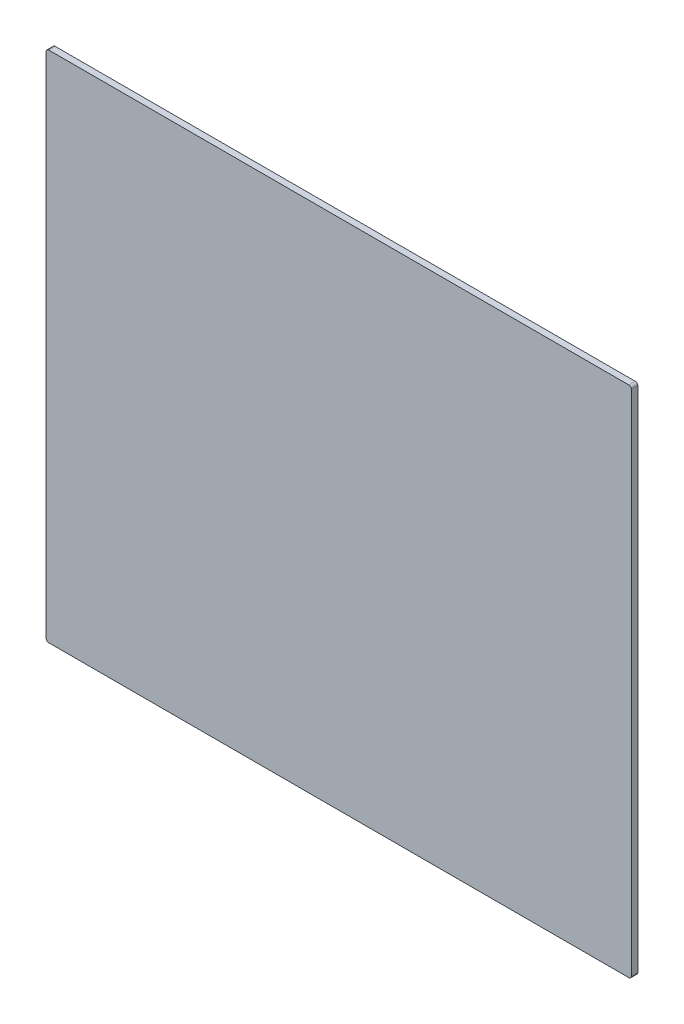
ISO-10303-21;
HEADER;
FILE_DESCRIPTION(('STEP AP214'),'2;1');
FILE_NAME('part.step','',(''),(''),'','','');
FILE_SCHEMA(('AUTOMOTIVE_DESIGN { 1 0 10303 214 1 1 1 1 }'));
ENDSEC;
DATA;
#1=APPLICATION_CONTEXT('core data for automotive mechanical design processes');
#2=APPLICATION_PROTOCOL_DEFINITION('international standard','automotive_design',2000,#1);
#3=PRODUCT_CONTEXT('',#1,'mechanical');
#4=PRODUCT('Part','Part','',(#3));
#5=PRODUCT_RELATED_PRODUCT_CATEGORY('part','',(#4));
#6=PRODUCT_DEFINITION_FORMATION('','',#4);
#7=PRODUCT_DEFINITION_CONTEXT('part definition',#1,'design');
#8=PRODUCT_DEFINITION('design','',#6,#7);
#9=PRODUCT_DEFINITION_SHAPE('','',#8);
#10=(LENGTH_UNIT() NAMED_UNIT(*) SI_UNIT(.MILLI.,.METRE.));
#11=(NAMED_UNIT(*) PLANE_ANGLE_UNIT() SI_UNIT($,.RADIAN.));
#12=(NAMED_UNIT(*) SI_UNIT($,.STERADIAN.) SOLID_ANGLE_UNIT());
#13=UNCERTAINTY_MEASURE_WITH_UNIT(LENGTH_MEASURE(1.E-05),#10,'distance_accuracy_value','');
#14=(GEOMETRIC_REPRESENTATION_CONTEXT(3) GLOBAL_UNCERTAINTY_ASSIGNED_CONTEXT((#13)) GLOBAL_UNIT_ASSIGNED_CONTEXT((#10,
#11,#12)) REPRESENTATION_CONTEXT('',''));
#15=CARTESIAN_POINT('',(0.,0.,0.));
#16=DIRECTION('',(0.,0.,1.));
#17=DIRECTION('',(1.,0.,0.));
#18=AXIS2_PLACEMENT_3D('',#15,#16,#17);
#19=CARTESIAN_POINT('',(-452.,396.,10.));
#20=DIRECTION('',(0.,0.,-1.));
#21=DIRECTION('',(-1.,0.,0.));
#22=AXIS2_PLACEMENT_3D('',#19,#20,#21);
#23=CYLINDRICAL_SURFACE('',#22,4.);
#24=CARTESIAN_POINT('',(-452.,396.,0.));
#25=DIRECTION('',(0.,0.,1.));
#26=DIRECTION('',(-1.,0.,0.));
#27=AXIS2_PLACEMENT_3D('',#24,#25,#26);
#28=CIRCLE('',#27,4.);
#29=CARTESIAN_POINT('',(-452.,400.,0.));
#30=VERTEX_POINT('',#29);
#31=CARTESIAN_POINT('',(-456.,396.,0.));
#32=VERTEX_POINT('',#31);
#33=EDGE_CURVE('E129',#30,#32,#28,.T.);
#34=ORIENTED_EDGE('',*,*,#33,.T.);
#35=DIRECTION('',(0.,0.,-1.));
#36=VECTOR('',#35,1.);
#37=CARTESIAN_POINT('',(-456.,396.,10.));
#38=LINE('',#37,#36);
#39=CARTESIAN_POINT('',(-456.,396.,10.));
#40=VERTEX_POINT('',#39);
#41=EDGE_CURVE('E11',#40,#32,#38,.T.);
#42=ORIENTED_EDGE('',*,*,#41,.F.);
#43=CARTESIAN_POINT('',(-452.,396.,10.));
#44=DIRECTION('',(0.,0.,1.));
#45=DIRECTION('',(-1.,0.,0.));
#46=AXIS2_PLACEMENT_3D('',#43,#44,#45);
#47=CIRCLE('',#46,4.);
#48=CARTESIAN_POINT('',(-452.,400.,10.));
#49=VERTEX_POINT('',#48);
#50=EDGE_CURVE('E143',#49,#40,#47,.T.);
#51=ORIENTED_EDGE('',*,*,#50,.F.);
#52=DIRECTION('',(0.,0.,-1.));
#53=VECTOR('',#52,1.);
#54=CARTESIAN_POINT('',(-452.,400.,10.));
#55=LINE('',#54,#53);
#56=EDGE_CURVE('E125',#49,#30,#55,.T.);
#57=ORIENTED_EDGE('',*,*,#56,.T.);
#58=EDGE_LOOP('',(#34,#42,#51,#57));
#59=FACE_BOUND('',#58,.T.);
#60=ADVANCED_FACE('F33',(#59),#23,.T.);
#61=CARTESIAN_POINT('',(-456.,-396.,10.));
#62=DIRECTION('',(1.,0.,0.));
#63=DIRECTION('',(0.,0.,-1.));
#64=AXIS2_PLACEMENT_3D('',#61,#62,#63);
#65=PLANE('',#64);
#66=DIRECTION('',(0.,-1.,0.));
#67=VECTOR('',#66,1.);
#68=CARTESIAN_POINT('',(-456.,-396.,0.));
#69=LINE('',#68,#67);
#70=CARTESIAN_POINT('',(-456.,-396.,0.));
#71=VERTEX_POINT('',#70);
#72=EDGE_CURVE('E132',#32,#71,#69,.T.);
#73=ORIENTED_EDGE('',*,*,#72,.T.);
#74=DIRECTION('',(0.,0.,-1.));
#75=VECTOR('',#74,1.);
#76=CARTESIAN_POINT('',(-456.,-396.,10.));
#77=LINE('',#76,#75);
#78=CARTESIAN_POINT('',(-456.,-396.,10.));
#79=VERTEX_POINT('',#78);
#80=EDGE_CURVE('E41',#79,#71,#77,.T.);
#81=ORIENTED_EDGE('',*,*,#80,.F.);
#82=DIRECTION('',(0.,-1.,0.));
#83=VECTOR('',#82,1.);
#84=CARTESIAN_POINT('',(-456.,-396.,10.));
#85=LINE('',#84,#83);
#86=EDGE_CURVE('E92',#40,#79,#85,.T.);
#87=ORIENTED_EDGE('',*,*,#86,.F.);
#88=ORIENTED_EDGE('',*,*,#41,.T.);
#89=EDGE_LOOP('',(#73,#81,#87,#88));
#90=FACE_BOUND('',#89,.T.);
#91=ADVANCED_FACE('F178',(#90),#65,.F.);
#92=CARTESIAN_POINT('',(-452.,-396.,10.));
#93=DIRECTION('',(0.,0.,-1.));
#94=DIRECTION('',(-1.,0.,0.));
#95=AXIS2_PLACEMENT_3D('',#92,#93,#94);
#96=CYLINDRICAL_SURFACE('',#95,4.);
#97=CARTESIAN_POINT('',(-452.,-396.,0.));
#98=DIRECTION('',(0.,0.,1.));
#99=DIRECTION('',(1.,0.,0.));
#100=AXIS2_PLACEMENT_3D('',#97,#98,#99);
#101=CIRCLE('',#100,4.);
#102=CARTESIAN_POINT('',(-452.,-400.,0.));
#103=VERTEX_POINT('',#102);
#104=EDGE_CURVE('E134',#71,#103,#101,.T.);
#105=ORIENTED_EDGE('',*,*,#104,.T.);
#106=DIRECTION('',(0.,0.,-1.));
#107=VECTOR('',#106,1.);
#108=CARTESIAN_POINT('',(-452.,-400.,10.));
#109=LINE('',#108,#107);
#110=CARTESIAN_POINT('',(-452.,-400.,10.));
#111=VERTEX_POINT('',#110);
#112=EDGE_CURVE('E150',#111,#103,#109,.T.);
#113=ORIENTED_EDGE('',*,*,#112,.F.);
#114=CARTESIAN_POINT('',(-452.,-396.,10.));
#115=DIRECTION('',(0.,0.,1.));
#116=DIRECTION('',(1.,0.,0.));
#117=AXIS2_PLACEMENT_3D('',#114,#115,#116);
#118=CIRCLE('',#117,4.);
#119=EDGE_CURVE('E158',#79,#111,#118,.T.);
#120=ORIENTED_EDGE('',*,*,#119,.F.);
#121=ORIENTED_EDGE('',*,*,#80,.T.);
#122=EDGE_LOOP('',(#105,#113,#120,#121));
#123=FACE_BOUND('',#122,.T.);
#124=ADVANCED_FACE('F156',(#123),#96,.T.);
#125=CARTESIAN_POINT('',(-452.,-400.,10.));
#126=DIRECTION('',(0.,1.,0.));
#127=DIRECTION('',(0.,0.,1.));
#128=AXIS2_PLACEMENT_3D('',#125,#126,#127);
#129=PLANE('',#128);
#130=DIRECTION('',(1.,0.,0.));
#131=VECTOR('',#130,1.);
#132=CARTESIAN_POINT('',(-452.,-400.,0.));
#133=LINE('',#132,#131);
#134=CARTESIAN_POINT('',(452.,-400.,0.));
#135=VERTEX_POINT('',#134);
#136=EDGE_CURVE('E136',#103,#135,#133,.T.);
#137=ORIENTED_EDGE('',*,*,#136,.T.);
#138=DIRECTION('',(0.,0.,-1.));
#139=VECTOR('',#138,1.);
#140=CARTESIAN_POINT('',(452.,-400.,10.));
#141=LINE('',#140,#139);
#142=CARTESIAN_POINT('',(452.,-400.,10.));
#143=VERTEX_POINT('',#142);
#144=EDGE_CURVE('E147',#143,#135,#141,.T.);
#145=ORIENTED_EDGE('',*,*,#144,.F.);
#146=DIRECTION('',(1.,0.,0.));
#147=VECTOR('',#146,1.);
#148=CARTESIAN_POINT('',(-452.,-400.,10.));
#149=LINE('',#148,#147);
#150=EDGE_CURVE('E170',#111,#143,#149,.T.);
#151=ORIENTED_EDGE('',*,*,#150,.F.);
#152=ORIENTED_EDGE('',*,*,#112,.T.);
#153=EDGE_LOOP('',(#137,#145,#151,#152));
#154=FACE_BOUND('',#153,.T.);
#155=ADVANCED_FACE('F166',(#154),#129,.F.);
#156=CARTESIAN_POINT('',(452.,-396.,10.));
#157=DIRECTION('',(0.,0.,-1.));
#158=DIRECTION('',(-1.,0.,0.));
#159=AXIS2_PLACEMENT_3D('',#156,#157,#158);
#160=CYLINDRICAL_SURFACE('',#159,4.);
#161=CARTESIAN_POINT('',(452.,-396.,0.));
#162=DIRECTION('',(0.,0.,1.));
#163=DIRECTION('',(1.,0.,0.));
#164=AXIS2_PLACEMENT_3D('',#161,#162,#163);
#165=CIRCLE('',#164,4.);
#166=CARTESIAN_POINT('',(456.,-396.,0.));
#167=VERTEX_POINT('',#166);
#168=EDGE_CURVE('E138',#135,#167,#165,.T.);
#169=ORIENTED_EDGE('',*,*,#168,.T.);
#170=DIRECTION('',(0.,0.,-1.));
#171=VECTOR('',#170,1.);
#172=CARTESIAN_POINT('',(456.,-396.,10.));
#173=LINE('',#172,#171);
#174=CARTESIAN_POINT('',(456.,-396.,10.));
#175=VERTEX_POINT('',#174);
#176=EDGE_CURVE('E120',#175,#167,#173,.T.);
#177=ORIENTED_EDGE('',*,*,#176,.F.);
#178=CARTESIAN_POINT('',(452.,-396.,10.));
#179=DIRECTION('',(0.,0.,1.));
#180=DIRECTION('',(1.,0.,0.));
#181=AXIS2_PLACEMENT_3D('',#178,#179,#180);
#182=CIRCLE('',#181,4.);
#183=EDGE_CURVE('E111',#143,#175,#182,.T.);
#184=ORIENTED_EDGE('',*,*,#183,.F.);
#185=ORIENTED_EDGE('',*,*,#144,.T.);
#186=EDGE_LOOP('',(#169,#177,#184,#185));
#187=FACE_BOUND('',#186,.T.);
#188=ADVANCED_FACE('F169',(#187),#160,.T.);
#189=CARTESIAN_POINT('',(456.,-396.,10.));
#190=DIRECTION('',(-1.,0.,0.));
#191=DIRECTION('',(0.,0.,1.));
#192=AXIS2_PLACEMENT_3D('',#189,#190,#191);
#193=PLANE('',#192);
#194=DIRECTION('',(0.,1.,0.));
#195=VECTOR('',#194,1.);
#196=CARTESIAN_POINT('',(456.,-396.,0.));
#197=LINE('',#196,#195);
#198=CARTESIAN_POINT('',(456.,396.,0.));
#199=VERTEX_POINT('',#198);
#200=EDGE_CURVE('E119',#167,#199,#197,.T.);
#201=ORIENTED_EDGE('',*,*,#200,.T.);
#202=DIRECTION('',(0.,0.,-1.));
#203=VECTOR('',#202,1.);
#204=CARTESIAN_POINT('',(456.,396.,10.));
#205=LINE('',#204,#203);
#206=CARTESIAN_POINT('',(456.,396.,10.));
#207=VERTEX_POINT('',#206);
#208=EDGE_CURVE('E116',#207,#199,#205,.T.);
#209=ORIENTED_EDGE('',*,*,#208,.F.);
#210=DIRECTION('',(0.,1.,0.));
#211=VECTOR('',#210,1.);
#212=CARTESIAN_POINT('',(456.,-396.,10.));
#213=LINE('',#212,#211);
#214=EDGE_CURVE('E105',#175,#207,#213,.T.);
#215=ORIENTED_EDGE('',*,*,#214,.F.);
#216=ORIENTED_EDGE('',*,*,#176,.T.);
#217=EDGE_LOOP('',(#201,#209,#215,#216));
#218=FACE_BOUND('',#217,.T.);
#219=ADVANCED_FACE('F117',(#218),#193,.F.);
#220=CARTESIAN_POINT('',(452.,396.,10.));
#221=DIRECTION('',(0.,0.,-1.));
#222=DIRECTION('',(-1.,0.,0.));
#223=AXIS2_PLACEMENT_3D('',#220,#221,#222);
#224=CYLINDRICAL_SURFACE('',#223,4.);
#225=CARTESIAN_POINT('',(452.,396.,0.));
#226=DIRECTION('',(0.,0.,1.));
#227=DIRECTION('',(1.,0.,0.));
#228=AXIS2_PLACEMENT_3D('',#225,#226,#227);
#229=CIRCLE('',#228,4.);
#230=CARTESIAN_POINT('',(452.,400.,0.));
#231=VERTEX_POINT('',#230);
#232=EDGE_CURVE('E78',#199,#231,#229,.T.);
#233=ORIENTED_EDGE('',*,*,#232,.T.);
#234=DIRECTION('',(0.,0.,-1.));
#235=VECTOR('',#234,1.);
#236=CARTESIAN_POINT('',(452.,400.,10.));
#237=LINE('',#236,#235);
#238=CARTESIAN_POINT('',(452.,400.,10.));
#239=VERTEX_POINT('',#238);
#240=EDGE_CURVE('E121',#239,#231,#237,.T.);
#241=ORIENTED_EDGE('',*,*,#240,.F.);
#242=CARTESIAN_POINT('',(452.,396.,10.));
#243=DIRECTION('',(0.,0.,1.));
#244=DIRECTION('',(1.,0.,0.));
#245=AXIS2_PLACEMENT_3D('',#242,#243,#244);
#246=CIRCLE('',#245,4.);
#247=EDGE_CURVE('E109',#207,#239,#246,.T.);
#248=ORIENTED_EDGE('',*,*,#247,.F.);
#249=ORIENTED_EDGE('',*,*,#208,.T.);
#250=EDGE_LOOP('',(#233,#241,#248,#249));
#251=FACE_BOUND('',#250,.T.);
#252=ADVANCED_FACE('F123',(#251),#224,.T.);
#253=CARTESIAN_POINT('',(-452.,400.,10.));
#254=DIRECTION('',(0.,-1.,0.));
#255=DIRECTION('',(0.,0.,-1.));
#256=AXIS2_PLACEMENT_3D('',#253,#254,#255);
#257=PLANE('',#256);
#258=DIRECTION('',(-1.,0.,0.));
#259=VECTOR('',#258,1.);
#260=CARTESIAN_POINT('',(-452.,400.,0.));
#261=LINE('',#260,#259);
#262=EDGE_CURVE('E84',#231,#30,#261,.T.);
#263=ORIENTED_EDGE('',*,*,#262,.T.);
#264=ORIENTED_EDGE('',*,*,#56,.F.);
#265=DIRECTION('',(-1.,0.,0.));
#266=VECTOR('',#265,1.);
#267=CARTESIAN_POINT('',(-452.,400.,10.));
#268=LINE('',#267,#266);
#269=EDGE_CURVE('E49',#239,#49,#268,.T.);
#270=ORIENTED_EDGE('',*,*,#269,.F.);
#271=ORIENTED_EDGE('',*,*,#240,.T.);
#272=EDGE_LOOP('',(#263,#264,#270,#271));
#273=FACE_BOUND('',#272,.T.);
#274=ADVANCED_FACE('F194',(#273),#257,.F.);
#275=CARTESIAN_POINT('',(-452.,396.,10.));
#276=DIRECTION('',(0.,0.,-1.));
#277=DIRECTION('',(-1.,0.,0.));
#278=AXIS2_PLACEMENT_3D('',#275,#276,#277);
#279=PLANE('',#278);
#280=ORIENTED_EDGE('',*,*,#50,.T.);
#281=ORIENTED_EDGE('',*,*,#86,.T.);
#282=ORIENTED_EDGE('',*,*,#119,.T.);
#283=ORIENTED_EDGE('',*,*,#150,.T.);
#284=ORIENTED_EDGE('',*,*,#183,.T.);
#285=ORIENTED_EDGE('',*,*,#214,.T.);
#286=ORIENTED_EDGE('',*,*,#247,.T.);
#287=ORIENTED_EDGE('',*,*,#269,.T.);
#288=EDGE_LOOP('',(#280,#281,#282,#283,#284,#285,#286,#287));
#289=FACE_BOUND('',#288,.T.);
#290=ADVANCED_FACE('F107',(#289),#279,.F.);
#291=CARTESIAN_POINT('',(-452.,396.,0.));
#292=DIRECTION('',(0.,0.,-1.));
#293=DIRECTION('',(-1.,0.,0.));
#294=AXIS2_PLACEMENT_3D('',#291,#292,#293);
#295=PLANE('',#294);
#296=ORIENTED_EDGE('',*,*,#33,.F.);
#297=ORIENTED_EDGE('',*,*,#262,.F.);
#298=ORIENTED_EDGE('',*,*,#232,.F.);
#299=ORIENTED_EDGE('',*,*,#200,.F.);
#300=ORIENTED_EDGE('',*,*,#168,.F.);
#301=ORIENTED_EDGE('',*,*,#136,.F.);
#302=ORIENTED_EDGE('',*,*,#104,.F.);
#303=ORIENTED_EDGE('',*,*,#72,.F.);
#304=EDGE_LOOP('',(#296,#297,#298,#299,#300,#301,#302,#303));
#305=FACE_BOUND('',#304,.T.);
#306=ADVANCED_FACE('F162',(#305),#295,.T.);
#307=CLOSED_SHELL('',(#60,#91,#124,#155,#188,#219,#252,#274,#290,#306));
#308=MANIFOLD_SOLID_BREP('B2',#307);
#309=ADVANCED_BREP_SHAPE_REPRESENTATION('',(#18,#308),#14);
#310=SHAPE_DEFINITION_REPRESENTATION(#9,#309);
ENDSEC;
END-ISO-10303-21;
